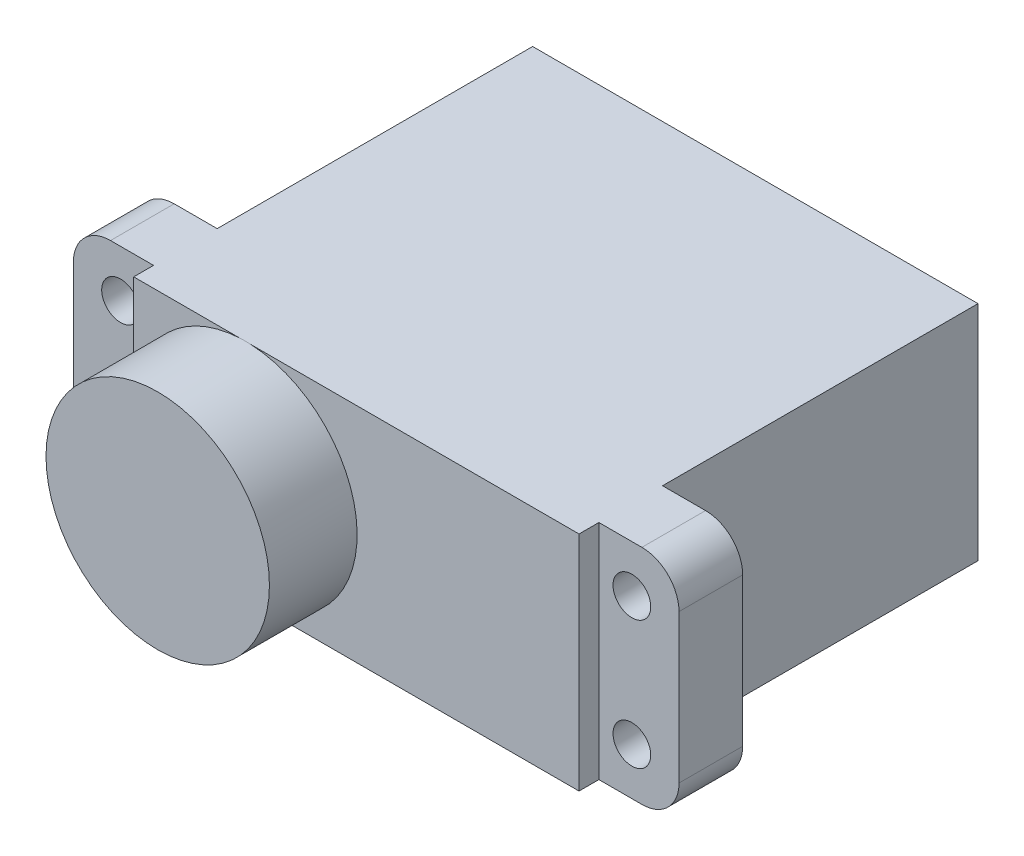
ISO-10303-21;
HEADER;
FILE_DESCRIPTION(('STEP AP214'),'2;1');
FILE_NAME('part.step','',(''),(''),'','','');
FILE_SCHEMA(('AUTOMOTIVE_DESIGN { 1 0 10303 214 1 1 1 1 }'));
ENDSEC;
DATA;
#1=APPLICATION_CONTEXT('core data for automotive mechanical design processes');
#2=APPLICATION_PROTOCOL_DEFINITION('international standard','automotive_design',2000,#1);
#3=PRODUCT_CONTEXT('',#1,'mechanical');
#4=PRODUCT('Part','Part','',(#3));
#5=PRODUCT_RELATED_PRODUCT_CATEGORY('part','',(#4));
#6=PRODUCT_DEFINITION_FORMATION('','',#4);
#7=PRODUCT_DEFINITION_CONTEXT('part definition',#1,'design');
#8=PRODUCT_DEFINITION('design','',#6,#7);
#9=PRODUCT_DEFINITION_SHAPE('','',#8);
#10=(LENGTH_UNIT() NAMED_UNIT(*) SI_UNIT(.MILLI.,.METRE.));
#11=(NAMED_UNIT(*) PLANE_ANGLE_UNIT() SI_UNIT($,.RADIAN.));
#12=(NAMED_UNIT(*) SI_UNIT($,.STERADIAN.) SOLID_ANGLE_UNIT());
#13=UNCERTAINTY_MEASURE_WITH_UNIT(LENGTH_MEASURE(1.E-05),#10,'distance_accuracy_value','');
#14=(GEOMETRIC_REPRESENTATION_CONTEXT(3) GLOBAL_UNCERTAINTY_ASSIGNED_CONTEXT((#13)) GLOBAL_UNIT_ASSIGNED_CONTEXT((#10,
#11,#12)) REPRESENTATION_CONTEXT('',''));
#15=CARTESIAN_POINT('',(0.,0.,0.));
#16=DIRECTION('',(0.,0.,1.));
#17=DIRECTION('',(1.,0.,0.));
#18=AXIS2_PLACEMENT_3D('',#15,#16,#17);
#19=CARTESIAN_POINT('',(0.,0.,21.5));
#20=DIRECTION('',(0.,0.,-1.));
#21=DIRECTION('',(-1.,0.,0.));
#22=AXIS2_PLACEMENT_3D('',#19,#20,#21);
#23=PLANE('',#22);
#24=CARTESIAN_POINT('',(-17.98,5.98713314139232,21.5));
#25=DIRECTION('',(0.,0.,1.));
#26=DIRECTION('',(1.,0.,0.));
#27=AXIS2_PLACEMENT_3D('',#24,#25,#26);
#28=CIRCLE('',#27,6.02);
#29=CARTESIAN_POINT('',(-18.2729712283782,12.,21.5));
#30=VERTEX_POINT('',#29);
#31=CARTESIAN_POINT('',(-24.,5.98713314139232,21.5));
#32=VERTEX_POINT('',#31);
#33=EDGE_CURVE('E11',#30,#32,#28,.T.);
#34=ORIENTED_EDGE('',*,*,#33,.F.);
#35=DIRECTION('',(-1.,0.,0.));
#36=VECTOR('',#35,1.);
#37=CARTESIAN_POINT('',(0.,12.,21.5));
#38=LINE('',#37,#36);
#39=CARTESIAN_POINT('',(-24.,12.,21.5));
#40=VERTEX_POINT('',#39);
#41=EDGE_CURVE('E168',#30,#40,#38,.T.);
#42=ORIENTED_EDGE('',*,*,#41,.T.);
#43=DIRECTION('',(0.,-1.,0.));
#44=VECTOR('',#43,1.);
#45=CARTESIAN_POINT('',(-24.,12.,21.5));
#46=LINE('',#45,#44);
#47=EDGE_CURVE('E337',#40,#32,#46,.T.);
#48=ORIENTED_EDGE('',*,*,#47,.T.);
#49=EDGE_LOOP('',(#34,#42,#48));
#50=FACE_BOUND('',#49,.T.);
#51=ADVANCED_FACE('F27',(#50),#23,.F.);
#52=CARTESIAN_POINT('',(-18.60820119965,0.,21.5));
#53=VERTEX_POINT('',#52);
#54=EDGE_CURVE('E36',#32,#53,#28,.T.);
#55=ORIENTED_EDGE('',*,*,#54,.F.);
#56=CARTESIAN_POINT('',(-24.,0.,21.5));
#57=VERTEX_POINT('',#56);
#58=EDGE_CURVE('E165',#32,#57,#46,.T.);
#59=ORIENTED_EDGE('',*,*,#58,.T.);
#60=DIRECTION('',(1.,0.,0.));
#61=VECTOR('',#60,1.);
#62=CARTESIAN_POINT('',(0.,0.,21.5));
#63=LINE('',#62,#61);
#64=EDGE_CURVE('E332',#57,#53,#63,.T.);
#65=ORIENTED_EDGE('',*,*,#64,.T.);
#66=EDGE_LOOP('',(#55,#59,#65));
#67=FACE_BOUND('',#66,.T.);
#68=ADVANCED_FACE('F262',(#67),#23,.F.);
#69=CARTESIAN_POINT('',(-17.35179880035,0.,21.5));
#70=VERTEX_POINT('',#69);
#71=CARTESIAN_POINT('',(-17.6870287716218,12.,21.5));
#72=VERTEX_POINT('',#71);
#73=EDGE_CURVE('E45',#70,#72,#28,.T.);
#74=ORIENTED_EDGE('',*,*,#73,.F.);
#75=CARTESIAN_POINT('',(0.,0.,21.5));
#76=VERTEX_POINT('',#75);
#77=EDGE_CURVE('E341',#70,#76,#63,.T.);
#78=ORIENTED_EDGE('',*,*,#77,.T.);
#79=DIRECTION('',(0.,1.,0.));
#80=VECTOR('',#79,1.);
#81=CARTESIAN_POINT('',(0.,12.,21.5));
#82=LINE('',#81,#80);
#83=CARTESIAN_POINT('',(0.,12.,21.5));
#84=VERTEX_POINT('',#83);
#85=EDGE_CURVE('E161',#76,#84,#82,.T.);
#86=ORIENTED_EDGE('',*,*,#85,.T.);
#87=EDGE_CURVE('E157',#84,#72,#38,.T.);
#88=ORIENTED_EDGE('',*,*,#87,.T.);
#89=EDGE_LOOP('',(#74,#78,#86,#88));
#90=FACE_BOUND('',#89,.T.);
#91=ADVANCED_FACE('F159',(#90),#23,.F.);
#92=CARTESIAN_POINT('',(4.318,12.,20.43));
#93=DIRECTION('',(0.,0.,1.));
#94=DIRECTION('',(1.,0.,0.));
#95=AXIS2_PLACEMENT_3D('',#92,#93,#94);
#96=PLANE('',#95);
#97=CARTESIAN_POINT('',(1.77799999999999,2.53620246957807,20.43));
#98=DIRECTION('',(0.,0.,-1.));
#99=DIRECTION('',(-1.,0.,0.));
#100=AXIS2_PLACEMENT_3D('',#97,#98,#99);
#101=CIRCLE('',#100,1.016);
#102=CARTESIAN_POINT('',(0.761999999999991,2.53620246957807,20.43));
#103=VERTEX_POINT('',#102);
#104=EDGE_CURVE('E192',#103,#103,#101,.T.);
#105=ORIENTED_EDGE('',*,*,#104,.T.);
#106=EDGE_LOOP('',(#105));
#107=FACE_BOUND('',#106,.T.);
#108=DIRECTION('',(-1.,0.,0.));
#109=VECTOR('',#108,1.);
#110=CARTESIAN_POINT('',(4.31799999999999,0.,20.43));
#111=LINE('',#110,#109);
#112=CARTESIAN_POINT('',(2.31799999999999,0.,20.43));
#113=VERTEX_POINT('',#112);
#114=CARTESIAN_POINT('',(0.,0.,20.43));
#115=VERTEX_POINT('',#114);
#116=EDGE_CURVE('E213',#113,#115,#111,.T.);
#117=ORIENTED_EDGE('',*,*,#116,.F.);
#118=CARTESIAN_POINT('',(2.31799999999999,2.,20.43));
#119=DIRECTION('',(0.,0.,1.));
#120=DIRECTION('',(1.,0.,0.));
#121=AXIS2_PLACEMENT_3D('',#118,#119,#120);
#122=CIRCLE('',#121,2.);
#123=CARTESIAN_POINT('',(4.31799999999999,2.,20.43));
#124=VERTEX_POINT('',#123);
#125=EDGE_CURVE('E223',#113,#124,#122,.T.);
#126=ORIENTED_EDGE('',*,*,#125,.T.);
#127=DIRECTION('',(0.,1.,0.));
#128=VECTOR('',#127,1.);
#129=CARTESIAN_POINT('',(4.318,12.,20.43));
#130=LINE('',#129,#128);
#131=CARTESIAN_POINT('',(4.318,10.,20.43));
#132=VERTEX_POINT('',#131);
#133=EDGE_CURVE('E416',#124,#132,#130,.T.);
#134=ORIENTED_EDGE('',*,*,#133,.T.);
#135=CARTESIAN_POINT('',(2.318,10.,20.43));
#136=DIRECTION('',(0.,0.,1.));
#137=DIRECTION('',(1.,0.,0.));
#138=AXIS2_PLACEMENT_3D('',#135,#136,#137);
#139=CIRCLE('',#138,2.);
#140=CARTESIAN_POINT('',(2.318,12.,20.43));
#141=VERTEX_POINT('',#140);
#142=EDGE_CURVE('E224',#132,#141,#139,.T.);
#143=ORIENTED_EDGE('',*,*,#142,.T.);
#144=DIRECTION('',(-1.,0.,0.));
#145=VECTOR('',#144,1.);
#146=CARTESIAN_POINT('',(4.318,12.,20.43));
#147=LINE('',#146,#145);
#148=CARTESIAN_POINT('',(0.,12.,20.43));
#149=VERTEX_POINT('',#148);
#150=EDGE_CURVE('E210',#141,#149,#147,.T.);
#151=ORIENTED_EDGE('',*,*,#150,.T.);
#152=DIRECTION('',(0.,1.,0.));
#153=VECTOR('',#152,1.);
#154=CARTESIAN_POINT('',(0.,12.,20.43));
#155=LINE('',#154,#153);
#156=EDGE_CURVE('E201',#115,#149,#155,.T.);
#157=ORIENTED_EDGE('',*,*,#156,.F.);
#158=EDGE_LOOP('',(#117,#126,#134,#143,#151,#157));
#159=FACE_BOUND('',#158,.T.);
#160=CARTESIAN_POINT('',(1.778,9.45999999999998,20.43));
#161=DIRECTION('',(0.,0.,-1.));
#162=DIRECTION('',(-1.,0.,0.));
#163=AXIS2_PLACEMENT_3D('',#160,#161,#162);
#164=CIRCLE('',#163,1.016);
#165=CARTESIAN_POINT('',(0.761999999999998,9.45999999999998,20.43));
#166=VERTEX_POINT('',#165);
#167=EDGE_CURVE('E187',#166,#166,#164,.T.);
#168=ORIENTED_EDGE('',*,*,#167,.T.);
#169=EDGE_LOOP('',(#168));
#170=FACE_BOUND('',#169,.T.);
#171=ADVANCED_FACE('F242',(#107,#159,#170),#96,.T.);
#172=CARTESIAN_POINT('',(4.318,12.,17.));
#173=DIRECTION('',(0.,0.,-1.));
#174=DIRECTION('',(-1.,0.,0.));
#175=AXIS2_PLACEMENT_3D('',#172,#173,#174);
#176=PLANE('',#175);
#177=CARTESIAN_POINT('',(1.77799999999999,2.53620246957807,17.));
#178=DIRECTION('',(0.,0.,-1.));
#179=DIRECTION('',(-1.,0.,0.));
#180=AXIS2_PLACEMENT_3D('',#177,#178,#179);
#181=CIRCLE('',#180,1.016);
#182=CARTESIAN_POINT('',(0.761999999999991,2.53620246957807,17.));
#183=VERTEX_POINT('',#182);
#184=EDGE_CURVE('E195',#183,#183,#181,.F.);
#185=ORIENTED_EDGE('',*,*,#184,.T.);
#186=EDGE_LOOP('',(#185));
#187=FACE_BOUND('',#186,.T.);
#188=DIRECTION('',(0.,-1.,0.));
#189=VECTOR('',#188,1.);
#190=CARTESIAN_POINT('',(4.318,12.,17.));
#191=LINE('',#190,#189);
#192=CARTESIAN_POINT('',(4.318,10.,17.));
#193=VERTEX_POINT('',#192);
#194=CARTESIAN_POINT('',(4.31799999999999,2.,17.));
#195=VERTEX_POINT('',#194);
#196=EDGE_CURVE('E417',#193,#195,#191,.T.);
#197=ORIENTED_EDGE('',*,*,#196,.T.);
#198=CARTESIAN_POINT('',(2.31799999999999,2.,17.));
#199=DIRECTION('',(0.,0.,-1.));
#200=DIRECTION('',(-1.,0.,0.));
#201=AXIS2_PLACEMENT_3D('',#198,#199,#200);
#202=CIRCLE('',#201,2.);
#203=CARTESIAN_POINT('',(2.31799999999999,0.,17.));
#204=VERTEX_POINT('',#203);
#205=EDGE_CURVE('E183',#195,#204,#202,.T.);
#206=ORIENTED_EDGE('',*,*,#205,.T.);
#207=DIRECTION('',(-1.,0.,0.));
#208=VECTOR('',#207,1.);
#209=CARTESIAN_POINT('',(4.31799999999999,0.,17.));
#210=LINE('',#209,#208);
#211=CARTESIAN_POINT('',(0.,0.,17.));
#212=VERTEX_POINT('',#211);
#213=EDGE_CURVE('E217',#204,#212,#210,.T.);
#214=ORIENTED_EDGE('',*,*,#213,.T.);
#215=DIRECTION('',(0.,-1.,0.));
#216=VECTOR('',#215,1.);
#217=CARTESIAN_POINT('',(0.,12.,17.));
#218=LINE('',#217,#216);
#219=CARTESIAN_POINT('',(0.,12.,17.));
#220=VERTEX_POINT('',#219);
#221=EDGE_CURVE('E205',#220,#212,#218,.T.);
#222=ORIENTED_EDGE('',*,*,#221,.F.);
#223=DIRECTION('',(-1.,0.,0.));
#224=VECTOR('',#223,1.);
#225=CARTESIAN_POINT('',(4.318,12.,17.));
#226=LINE('',#225,#224);
#227=CARTESIAN_POINT('',(2.318,12.,17.));
#228=VERTEX_POINT('',#227);
#229=EDGE_CURVE('E420',#228,#220,#226,.T.);
#230=ORIENTED_EDGE('',*,*,#229,.F.);
#231=CARTESIAN_POINT('',(2.318,10.,17.));
#232=DIRECTION('',(0.,0.,-1.));
#233=DIRECTION('',(-1.,0.,0.));
#234=AXIS2_PLACEMENT_3D('',#231,#232,#233);
#235=CIRCLE('',#234,2.);
#236=EDGE_CURVE('E425',#228,#193,#235,.T.);
#237=ORIENTED_EDGE('',*,*,#236,.T.);
#238=EDGE_LOOP('',(#197,#206,#214,#222,#230,#237));
#239=FACE_BOUND('',#238,.T.);
#240=CARTESIAN_POINT('',(1.778,9.45999999999998,17.));
#241=DIRECTION('',(0.,0.,-1.));
#242=DIRECTION('',(-1.,0.,0.));
#243=AXIS2_PLACEMENT_3D('',#240,#241,#242);
#244=CIRCLE('',#243,1.016);
#245=CARTESIAN_POINT('',(0.761999999999998,9.45999999999998,17.));
#246=VERTEX_POINT('',#245);
#247=EDGE_CURVE('E31',#246,#246,#244,.F.);
#248=ORIENTED_EDGE('',*,*,#247,.T.);
#249=EDGE_LOOP('',(#248));
#250=FACE_BOUND('',#249,.T.);
#251=ADVANCED_FACE('F231',(#187,#239,#250),#176,.T.);
#252=CARTESIAN_POINT('',(0.,12.,21.5));
#253=DIRECTION('',(-1.,0.,0.));
#254=DIRECTION('',(0.,0.,1.));
#255=AXIS2_PLACEMENT_3D('',#252,#253,#254);
#256=PLANE('',#255);
#257=DIRECTION('',(0.,0.,-1.));
#258=VECTOR('',#257,1.);
#259=CARTESIAN_POINT('',(0.,0.,21.5));
#260=LINE('',#259,#258);
#261=EDGE_CURVE('E354',#76,#115,#260,.T.);
#262=ORIENTED_EDGE('',*,*,#261,.T.);
#263=ORIENTED_EDGE('',*,*,#156,.T.);
#264=DIRECTION('',(0.,0.,-1.));
#265=VECTOR('',#264,1.);
#266=CARTESIAN_POINT('',(0.,12.,21.5));
#267=LINE('',#266,#265);
#268=EDGE_CURVE('E361',#84,#149,#267,.T.);
#269=ORIENTED_EDGE('',*,*,#268,.F.);
#270=ORIENTED_EDGE('',*,*,#85,.F.);
#271=EDGE_LOOP('',(#262,#263,#269,#270));
#272=FACE_BOUND('',#271,.T.);
#273=ADVANCED_FACE('F284',(#272),#256,.F.);
#274=CARTESIAN_POINT('',(-24.,12.,21.5));
#275=DIRECTION('',(1.,0.,0.));
#276=DIRECTION('',(0.,1.,0.));
#277=AXIS2_PLACEMENT_3D('',#274,#275,#276);
#278=PLANE('',#277);
#279=DIRECTION('',(0.,1.,0.));
#280=VECTOR('',#279,1.);
#281=CARTESIAN_POINT('',(-24.,12.,20.43));
#282=LINE('',#281,#280);
#283=CARTESIAN_POINT('',(-24.,0.,20.43));
#284=VERTEX_POINT('',#283);
#285=CARTESIAN_POINT('',(-24.,12.,20.43));
#286=VERTEX_POINT('',#285);
#287=EDGE_CURVE('E378',#284,#286,#282,.T.);
#288=ORIENTED_EDGE('',*,*,#287,.F.);
#289=DIRECTION('',(0.,0.,-1.));
#290=VECTOR('',#289,1.);
#291=CARTESIAN_POINT('',(-24.,0.,21.5));
#292=LINE('',#291,#290);
#293=EDGE_CURVE('E339',#57,#284,#292,.T.);
#294=ORIENTED_EDGE('',*,*,#293,.F.);
#295=ORIENTED_EDGE('',*,*,#58,.F.);
#296=ORIENTED_EDGE('',*,*,#47,.F.);
#297=DIRECTION('',(0.,0.,-1.));
#298=VECTOR('',#297,1.);
#299=CARTESIAN_POINT('',(-24.,12.,21.5));
#300=LINE('',#299,#298);
#301=EDGE_CURVE('E362',#40,#286,#300,.T.);
#302=ORIENTED_EDGE('',*,*,#301,.T.);
#303=EDGE_LOOP('',(#288,#294,#295,#296,#302));
#304=FACE_BOUND('',#303,.T.);
#305=ADVANCED_FACE('F279',(#304),#278,.F.);
#306=DIRECTION('',(0.,-1.,0.));
#307=VECTOR('',#306,1.);
#308=CARTESIAN_POINT('',(-24.,12.,17.));
#309=LINE('',#308,#307);
#310=CARTESIAN_POINT('',(-24.,12.,17.));
#311=VERTEX_POINT('',#310);
#312=CARTESIAN_POINT('',(-24.,0.,17.));
#313=VERTEX_POINT('',#312);
#314=EDGE_CURVE('E373',#311,#313,#309,.T.);
#315=ORIENTED_EDGE('',*,*,#314,.F.);
#316=CARTESIAN_POINT('',(-24.,12.,0.));
#317=VERTEX_POINT('',#316);
#318=EDGE_CURVE('E369',#311,#317,#300,.T.);
#319=ORIENTED_EDGE('',*,*,#318,.T.);
#320=DIRECTION('',(0.,-1.,0.));
#321=VECTOR('',#320,1.);
#322=CARTESIAN_POINT('',(-24.,12.,0.));
#323=LINE('',#322,#321);
#324=CARTESIAN_POINT('',(-24.,0.,0.));
#325=VERTEX_POINT('',#324);
#326=EDGE_CURVE('E398',#317,#325,#323,.T.);
#327=ORIENTED_EDGE('',*,*,#326,.T.);
#328=EDGE_CURVE('E357',#313,#325,#292,.T.);
#329=ORIENTED_EDGE('',*,*,#328,.F.);
#330=EDGE_LOOP('',(#315,#319,#327,#329));
#331=FACE_BOUND('',#330,.T.);
#332=ADVANCED_FACE('F283',(#331),#278,.F.);
#333=CARTESIAN_POINT('',(0.,12.,0.));
#334=VERTEX_POINT('',#333);
#335=EDGE_CURVE('E358',#220,#334,#267,.T.);
#336=ORIENTED_EDGE('',*,*,#335,.F.);
#337=ORIENTED_EDGE('',*,*,#221,.T.);
#338=CARTESIAN_POINT('',(0.,0.,0.));
#339=VERTEX_POINT('',#338);
#340=EDGE_CURVE('E345',#212,#339,#260,.T.);
#341=ORIENTED_EDGE('',*,*,#340,.T.);
#342=DIRECTION('',(0.,1.,0.));
#343=VECTOR('',#342,1.);
#344=CARTESIAN_POINT('',(0.,12.,0.));
#345=LINE('',#344,#343);
#346=EDGE_CURVE('E391',#339,#334,#345,.T.);
#347=ORIENTED_EDGE('',*,*,#346,.T.);
#348=EDGE_LOOP('',(#336,#337,#341,#347));
#349=FACE_BOUND('',#348,.T.);
#350=ADVANCED_FACE('F29',(#349),#256,.F.);
#351=CARTESIAN_POINT('',(0.,12.,21.5));
#352=DIRECTION('',(0.,-1.,0.));
#353=DIRECTION('',(1.,0.,0.));
#354=AXIS2_PLACEMENT_3D('',#351,#352,#353);
#355=PLANE('',#354);
#356=ORIENTED_EDGE('',*,*,#150,.F.);
#357=DIRECTION('',(0.,0.,-1.));
#358=VECTOR('',#357,1.);
#359=CARTESIAN_POINT('',(2.318,12.,21.5));
#360=LINE('',#359,#358);
#361=EDGE_CURVE('E422',#141,#228,#360,.T.);
#362=ORIENTED_EDGE('',*,*,#361,.T.);
#363=ORIENTED_EDGE('',*,*,#229,.T.);
#364=ORIENTED_EDGE('',*,*,#335,.T.);
#365=DIRECTION('',(-1.,0.,0.));
#366=VECTOR('',#365,1.);
#367=CARTESIAN_POINT('',(0.,12.,0.));
#368=LINE('',#367,#366);
#369=EDGE_CURVE('E394',#334,#317,#368,.T.);
#370=ORIENTED_EDGE('',*,*,#369,.T.);
#371=ORIENTED_EDGE('',*,*,#318,.F.);
#372=DIRECTION('',(1.,0.,0.));
#373=VECTOR('',#372,1.);
#374=CARTESIAN_POINT('',(-28.318,12.,17.));
#375=LINE('',#374,#373);
#376=CARTESIAN_POINT('',(-26.318,12.,17.));
#377=VERTEX_POINT('',#376);
#378=EDGE_CURVE('E464',#377,#311,#375,.T.);
#379=ORIENTED_EDGE('',*,*,#378,.F.);
#380=DIRECTION('',(0.,0.,-1.));
#381=VECTOR('',#380,1.);
#382=CARTESIAN_POINT('',(-26.318,12.,21.5));
#383=LINE('',#382,#381);
#384=CARTESIAN_POINT('',(-26.318,12.,20.43));
#385=VERTEX_POINT('',#384);
#386=EDGE_CURVE('E483',#377,#385,#383,.F.);
#387=ORIENTED_EDGE('',*,*,#386,.T.);
#388=DIRECTION('',(1.,0.,0.));
#389=VECTOR('',#388,1.);
#390=CARTESIAN_POINT('',(-28.318,12.,20.43));
#391=LINE('',#390,#389);
#392=EDGE_CURVE('E395',#385,#286,#391,.T.);
#393=ORIENTED_EDGE('',*,*,#392,.T.);
#394=ORIENTED_EDGE('',*,*,#301,.F.);
#395=ORIENTED_EDGE('',*,*,#41,.F.);
#396=EDGE_CURVE('E166',#72,#30,#38,.T.);
#397=ORIENTED_EDGE('',*,*,#396,.F.);
#398=ORIENTED_EDGE('',*,*,#87,.F.);
#399=ORIENTED_EDGE('',*,*,#268,.T.);
#400=EDGE_LOOP('',(#356,#362,#363,#364,#370,#371,#379,#387,#393,#394,#395,#397,#398,#399));
#401=FACE_BOUND('',#400,.T.);
#402=ADVANCED_FACE('F172',(#401),#355,.F.);
#403=CARTESIAN_POINT('',(0.,0.,21.5));
#404=DIRECTION('',(0.,1.,0.));
#405=DIRECTION('',(-1.,0.,0.));
#406=AXIS2_PLACEMENT_3D('',#403,#404,#405);
#407=PLANE('',#406);
#408=ORIENTED_EDGE('',*,*,#213,.F.);
#409=DIRECTION('',(0.,0.,1.));
#410=VECTOR('',#409,1.);
#411=CARTESIAN_POINT('',(2.31799999999999,0.,21.5));
#412=LINE('',#411,#410);
#413=EDGE_CURVE('E220',#204,#113,#412,.T.);
#414=ORIENTED_EDGE('',*,*,#413,.T.);
#415=ORIENTED_EDGE('',*,*,#116,.T.);
#416=ORIENTED_EDGE('',*,*,#261,.F.);
#417=ORIENTED_EDGE('',*,*,#77,.F.);
#418=EDGE_CURVE('E52',#53,#70,#63,.T.);
#419=ORIENTED_EDGE('',*,*,#418,.F.);
#420=ORIENTED_EDGE('',*,*,#64,.F.);
#421=ORIENTED_EDGE('',*,*,#293,.T.);
#422=DIRECTION('',(1.,0.,0.));
#423=VECTOR('',#422,1.);
#424=CARTESIAN_POINT('',(-28.318,0.,20.43));
#425=LINE('',#424,#423);
#426=CARTESIAN_POINT('',(-26.318,0.,20.43));
#427=VERTEX_POINT('',#426);
#428=EDGE_CURVE('E390',#427,#284,#425,.T.);
#429=ORIENTED_EDGE('',*,*,#428,.F.);
#430=DIRECTION('',(0.,0.,1.));
#431=VECTOR('',#430,1.);
#432=CARTESIAN_POINT('',(-26.318,0.,21.5));
#433=LINE('',#432,#431);
#434=CARTESIAN_POINT('',(-26.318,0.,17.));
#435=VERTEX_POINT('',#434);
#436=EDGE_CURVE('E459',#427,#435,#433,.F.);
#437=ORIENTED_EDGE('',*,*,#436,.T.);
#438=DIRECTION('',(1.,0.,0.));
#439=VECTOR('',#438,1.);
#440=CARTESIAN_POINT('',(-28.318,0.,17.));
#441=LINE('',#440,#439);
#442=EDGE_CURVE('E462',#435,#313,#441,.T.);
#443=ORIENTED_EDGE('',*,*,#442,.T.);
#444=ORIENTED_EDGE('',*,*,#328,.T.);
#445=DIRECTION('',(1.,0.,0.));
#446=VECTOR('',#445,1.);
#447=CARTESIAN_POINT('',(0.,0.,0.));
#448=LINE('',#447,#446);
#449=EDGE_CURVE('E401',#325,#339,#448,.T.);
#450=ORIENTED_EDGE('',*,*,#449,.T.);
#451=ORIENTED_EDGE('',*,*,#340,.F.);
#452=EDGE_LOOP('',(#408,#414,#415,#416,#417,#419,#420,#421,#429,#437,#443,#444,#450,#451));
#453=FACE_BOUND('',#452,.T.);
#454=ADVANCED_FACE('F294',(#453),#407,.F.);
#455=CARTESIAN_POINT('',(0.,0.,0.));
#456=DIRECTION('',(0.,0.,-1.));
#457=DIRECTION('',(-1.,0.,0.));
#458=AXIS2_PLACEMENT_3D('',#455,#456,#457);
#459=PLANE('',#458);
#460=ORIENTED_EDGE('',*,*,#346,.F.);
#461=ORIENTED_EDGE('',*,*,#449,.F.);
#462=ORIENTED_EDGE('',*,*,#326,.F.);
#463=ORIENTED_EDGE('',*,*,#369,.F.);
#464=EDGE_LOOP('',(#460,#461,#462,#463));
#465=FACE_BOUND('',#464,.T.);
#466=ADVANCED_FACE('F300',(#465),#459,.T.);
#467=CARTESIAN_POINT('',(-28.318,12.,20.43));
#468=DIRECTION('',(0.,0.,-1.));
#469=DIRECTION('',(-1.,0.,0.));
#470=AXIS2_PLACEMENT_3D('',#467,#468,#469);
#471=PLANE('',#470);
#472=CARTESIAN_POINT('',(-25.778,9.46,20.43));
#473=DIRECTION('',(0.,0.,1.));
#474=DIRECTION('',(1.,0.,0.));
#475=AXIS2_PLACEMENT_3D('',#472,#473,#474);
#476=CIRCLE('',#475,1.016);
#477=CARTESIAN_POINT('',(-24.762,9.46,20.43));
#478=VERTEX_POINT('',#477);
#479=EDGE_CURVE('E216',#478,#478,#476,.T.);
#480=ORIENTED_EDGE('',*,*,#479,.F.);
#481=EDGE_LOOP('',(#480));
#482=FACE_BOUND('',#481,.T.);
#483=CARTESIAN_POINT('',(-25.778,2.53620246957809,20.43));
#484=DIRECTION('',(0.,0.,1.));
#485=DIRECTION('',(1.,0.,0.));
#486=AXIS2_PLACEMENT_3D('',#483,#484,#485);
#487=CIRCLE('',#486,1.016);
#488=CARTESIAN_POINT('',(-24.762,2.53620246957809,20.43));
#489=VERTEX_POINT('',#488);
#490=EDGE_CURVE('E447',#489,#489,#487,.T.);
#491=ORIENTED_EDGE('',*,*,#490,.F.);
#492=EDGE_LOOP('',(#491));
#493=FACE_BOUND('',#492,.T.);
#494=DIRECTION('',(0.,1.,0.));
#495=VECTOR('',#494,1.);
#496=CARTESIAN_POINT('',(-28.318,12.,20.43));
#497=LINE('',#496,#495);
#498=CARTESIAN_POINT('',(-28.318,2.,20.43));
#499=VERTEX_POINT('',#498);
#500=CARTESIAN_POINT('',(-28.318,10.,20.43));
#501=VERTEX_POINT('',#500);
#502=EDGE_CURVE('E377',#499,#501,#497,.T.);
#503=ORIENTED_EDGE('',*,*,#502,.F.);
#504=CARTESIAN_POINT('',(-26.318,2.,20.43));
#505=DIRECTION('',(0.,0.,-1.));
#506=DIRECTION('',(-1.,0.,0.));
#507=AXIS2_PLACEMENT_3D('',#504,#505,#506);
#508=CIRCLE('',#507,2.);
#509=EDGE_CURVE('E461',#499,#427,#508,.F.);
#510=ORIENTED_EDGE('',*,*,#509,.T.);
#511=ORIENTED_EDGE('',*,*,#428,.T.);
#512=ORIENTED_EDGE('',*,*,#287,.T.);
#513=ORIENTED_EDGE('',*,*,#392,.F.);
#514=CARTESIAN_POINT('',(-26.318,10.,20.43));
#515=DIRECTION('',(0.,0.,-1.));
#516=DIRECTION('',(-1.,0.,0.));
#517=AXIS2_PLACEMENT_3D('',#514,#515,#516);
#518=CIRCLE('',#517,2.);
#519=EDGE_CURVE('E484',#385,#501,#518,.F.);
#520=ORIENTED_EDGE('',*,*,#519,.T.);
#521=EDGE_LOOP('',(#503,#510,#511,#512,#513,#520));
#522=FACE_BOUND('',#521,.T.);
#523=ADVANCED_FACE('F498',(#482,#493,#522),#471,.F.);
#524=CARTESIAN_POINT('',(-28.318,12.,17.));
#525=DIRECTION('',(0.,0.,1.));
#526=DIRECTION('',(1.,0.,0.));
#527=AXIS2_PLACEMENT_3D('',#524,#525,#526);
#528=PLANE('',#527);
#529=CARTESIAN_POINT('',(-25.778,9.46,17.));
#530=DIRECTION('',(0.,0.,1.));
#531=DIRECTION('',(1.,0.,0.));
#532=AXIS2_PLACEMENT_3D('',#529,#530,#531);
#533=CIRCLE('',#532,1.016);
#534=CARTESIAN_POINT('',(-24.762,9.46,17.));
#535=VERTEX_POINT('',#534);
#536=EDGE_CURVE('E446',#535,#535,#533,.T.);
#537=ORIENTED_EDGE('',*,*,#536,.T.);
#538=EDGE_LOOP('',(#537));
#539=FACE_BOUND('',#538,.T.);
#540=CARTESIAN_POINT('',(-25.778,2.53620246957809,17.));
#541=DIRECTION('',(0.,0.,1.));
#542=DIRECTION('',(1.,0.,0.));
#543=AXIS2_PLACEMENT_3D('',#540,#541,#542);
#544=CIRCLE('',#543,1.016);
#545=CARTESIAN_POINT('',(-24.762,2.53620246957809,17.));
#546=VERTEX_POINT('',#545);
#547=EDGE_CURVE('E449',#546,#546,#544,.T.);
#548=ORIENTED_EDGE('',*,*,#547,.T.);
#549=EDGE_LOOP('',(#548));
#550=FACE_BOUND('',#549,.T.);
#551=ORIENTED_EDGE('',*,*,#442,.F.);
#552=CARTESIAN_POINT('',(-26.318,2.,17.));
#553=DIRECTION('',(0.,0.,1.));
#554=DIRECTION('',(1.,0.,0.));
#555=AXIS2_PLACEMENT_3D('',#552,#553,#554);
#556=CIRCLE('',#555,2.);
#557=CARTESIAN_POINT('',(-28.318,2.,17.));
#558=VERTEX_POINT('',#557);
#559=EDGE_CURVE('E426',#435,#558,#556,.F.);
#560=ORIENTED_EDGE('',*,*,#559,.T.);
#561=DIRECTION('',(0.,-1.,0.));
#562=VECTOR('',#561,1.);
#563=CARTESIAN_POINT('',(-28.318,12.,17.));
#564=LINE('',#563,#562);
#565=CARTESIAN_POINT('',(-28.318,10.,17.));
#566=VERTEX_POINT('',#565);
#567=EDGE_CURVE('E387',#566,#558,#564,.T.);
#568=ORIENTED_EDGE('',*,*,#567,.F.);
#569=CARTESIAN_POINT('',(-26.318,10.,17.));
#570=DIRECTION('',(0.,0.,1.));
#571=DIRECTION('',(1.,0.,0.));
#572=AXIS2_PLACEMENT_3D('',#569,#570,#571);
#573=CIRCLE('',#572,2.);
#574=EDGE_CURVE('E477',#566,#377,#573,.F.);
#575=ORIENTED_EDGE('',*,*,#574,.T.);
#576=ORIENTED_EDGE('',*,*,#378,.T.);
#577=ORIENTED_EDGE('',*,*,#314,.T.);
#578=EDGE_LOOP('',(#551,#560,#568,#575,#576,#577));
#579=FACE_BOUND('',#578,.T.);
#580=ADVANCED_FACE('F505',(#539,#550,#579),#528,.F.);
#581=CARTESIAN_POINT('',(-28.318,12.,20.43));
#582=DIRECTION('',(1.,0.,0.));
#583=DIRECTION('',(0.,1.,0.));
#584=AXIS2_PLACEMENT_3D('',#581,#582,#583);
#585=PLANE('',#584);
#586=ORIENTED_EDGE('',*,*,#567,.T.);
#587=DIRECTION('',(0.,0.,1.));
#588=VECTOR('',#587,1.);
#589=CARTESIAN_POINT('',(-28.318,2.,20.43));
#590=LINE('',#589,#588);
#591=EDGE_CURVE('E466',#558,#499,#590,.T.);
#592=ORIENTED_EDGE('',*,*,#591,.T.);
#593=ORIENTED_EDGE('',*,*,#502,.T.);
#594=DIRECTION('',(0.,0.,-1.));
#595=VECTOR('',#594,1.);
#596=CARTESIAN_POINT('',(-28.318,10.,20.43));
#597=LINE('',#596,#595);
#598=EDGE_CURVE('E474',#501,#566,#597,.T.);
#599=ORIENTED_EDGE('',*,*,#598,.T.);
#600=EDGE_LOOP('',(#586,#592,#593,#599));
#601=FACE_BOUND('',#600,.T.);
#602=ADVANCED_FACE('F494',(#601),#585,.F.);
#603=CARTESIAN_POINT('',(-26.318,10.,20.43));
#604=DIRECTION('',(0.,0.,-1.));
#605=DIRECTION('',(-1.,0.,0.));
#606=AXIS2_PLACEMENT_3D('',#603,#604,#605);
#607=CYLINDRICAL_SURFACE('',#606,2.);
#608=ORIENTED_EDGE('',*,*,#519,.F.);
#609=ORIENTED_EDGE('',*,*,#386,.F.);
#610=ORIENTED_EDGE('',*,*,#574,.F.);
#611=ORIENTED_EDGE('',*,*,#598,.F.);
#612=EDGE_LOOP('',(#608,#609,#610,#611));
#613=FACE_BOUND('',#612,.T.);
#614=ADVANCED_FACE('F512',(#613),#607,.T.);
#615=CARTESIAN_POINT('',(-26.318,2.,20.43));
#616=DIRECTION('',(0.,0.,1.));
#617=DIRECTION('',(1.,0.,0.));
#618=AXIS2_PLACEMENT_3D('',#615,#616,#617);
#619=CYLINDRICAL_SURFACE('',#618,2.);
#620=ORIENTED_EDGE('',*,*,#559,.F.);
#621=ORIENTED_EDGE('',*,*,#436,.F.);
#622=ORIENTED_EDGE('',*,*,#509,.F.);
#623=ORIENTED_EDGE('',*,*,#591,.F.);
#624=EDGE_LOOP('',(#620,#621,#622,#623));
#625=FACE_BOUND('',#624,.T.);
#626=ADVANCED_FACE('F503',(#625),#619,.T.);
#627=CARTESIAN_POINT('',(-25.778,2.53620246957809,16.112));
#628=DIRECTION('',(0.,0.,1.));
#629=DIRECTION('',(1.,0.,0.));
#630=AXIS2_PLACEMENT_3D('',#627,#628,#629);
#631=CYLINDRICAL_SURFACE('',#630,1.016);
#632=ORIENTED_EDGE('',*,*,#490,.T.);
#633=EDGE_LOOP('',(#632));
#634=FACE_BOUND('',#633,.T.);
#635=ORIENTED_EDGE('',*,*,#547,.F.);
#636=EDGE_LOOP('',(#635));
#637=FACE_BOUND('',#636,.T.);
#638=ADVANCED_FACE('F520',(#634,#637),#631,.F.);
#639=CARTESIAN_POINT('',(-25.778,9.46,16.112));
#640=DIRECTION('',(0.,0.,1.));
#641=DIRECTION('',(1.,0.,0.));
#642=AXIS2_PLACEMENT_3D('',#639,#640,#641);
#643=CYLINDRICAL_SURFACE('',#642,1.016);
#644=ORIENTED_EDGE('',*,*,#479,.T.);
#645=EDGE_LOOP('',(#644));
#646=FACE_BOUND('',#645,.T.);
#647=ORIENTED_EDGE('',*,*,#536,.F.);
#648=EDGE_LOOP('',(#647));
#649=FACE_BOUND('',#648,.T.);
#650=ADVANCED_FACE('F557',(#646,#649),#643,.F.);
#651=CARTESIAN_POINT('',(4.318,12.,20.43));
#652=DIRECTION('',(-1.,0.,0.));
#653=DIRECTION('',(0.,1.,0.));
#654=AXIS2_PLACEMENT_3D('',#651,#652,#653);
#655=PLANE('',#654);
#656=ORIENTED_EDGE('',*,*,#133,.F.);
#657=DIRECTION('',(0.,0.,1.));
#658=VECTOR('',#657,1.);
#659=CARTESIAN_POINT('',(4.31799999999999,2.,20.43));
#660=LINE('',#659,#658);
#661=EDGE_CURVE('E226',#124,#195,#660,.F.);
#662=ORIENTED_EDGE('',*,*,#661,.T.);
#663=ORIENTED_EDGE('',*,*,#196,.F.);
#664=DIRECTION('',(0.,0.,-1.));
#665=VECTOR('',#664,1.);
#666=CARTESIAN_POINT('',(4.318,10.,20.43));
#667=LINE('',#666,#665);
#668=EDGE_CURVE('E428',#193,#132,#667,.F.);
#669=ORIENTED_EDGE('',*,*,#668,.T.);
#670=EDGE_LOOP('',(#656,#662,#663,#669));
#671=FACE_BOUND('',#670,.T.);
#672=ADVANCED_FACE('F441',(#671),#655,.F.);
#673=CARTESIAN_POINT('',(2.318,10.,21.5));
#674=DIRECTION('',(0.,0.,-1.));
#675=DIRECTION('',(-1.,0.,0.));
#676=AXIS2_PLACEMENT_3D('',#673,#674,#675);
#677=CYLINDRICAL_SURFACE('',#676,2.);
#678=ORIENTED_EDGE('',*,*,#142,.F.);
#679=ORIENTED_EDGE('',*,*,#668,.F.);
#680=ORIENTED_EDGE('',*,*,#236,.F.);
#681=ORIENTED_EDGE('',*,*,#361,.F.);
#682=EDGE_LOOP('',(#678,#679,#680,#681));
#683=FACE_BOUND('',#682,.T.);
#684=ADVANCED_FACE('F435',(#683),#677,.T.);
#685=CARTESIAN_POINT('',(2.31799999999999,2.,21.5));
#686=DIRECTION('',(0.,0.,1.));
#687=DIRECTION('',(1.,0.,0.));
#688=AXIS2_PLACEMENT_3D('',#685,#686,#687);
#689=CYLINDRICAL_SURFACE('',#688,2.);
#690=ORIENTED_EDGE('',*,*,#205,.F.);
#691=ORIENTED_EDGE('',*,*,#661,.F.);
#692=ORIENTED_EDGE('',*,*,#125,.F.);
#693=ORIENTED_EDGE('',*,*,#413,.F.);
#694=EDGE_LOOP('',(#690,#691,#692,#693));
#695=FACE_BOUND('',#694,.T.);
#696=ADVANCED_FACE('F238',(#695),#689,.T.);
#697=CARTESIAN_POINT('',(1.77799999999999,2.53620246957807,16.112));
#698=DIRECTION('',(0.,0.,1.));
#699=DIRECTION('',(1.,0.,0.));
#700=AXIS2_PLACEMENT_3D('',#697,#698,#699);
#701=CYLINDRICAL_SURFACE('',#700,1.016);
#702=ORIENTED_EDGE('',*,*,#184,.F.);
#703=EDGE_LOOP('',(#702));
#704=FACE_BOUND('',#703,.T.);
#705=ORIENTED_EDGE('',*,*,#104,.F.);
#706=EDGE_LOOP('',(#705));
#707=FACE_BOUND('',#706,.T.);
#708=ADVANCED_FACE('F234',(#704,#707),#701,.F.);
#709=CARTESIAN_POINT('',(1.778,9.45999999999998,16.112));
#710=DIRECTION('',(0.,0.,1.));
#711=DIRECTION('',(1.,0.,0.));
#712=AXIS2_PLACEMENT_3D('',#709,#710,#711);
#713=CYLINDRICAL_SURFACE('',#712,1.016);
#714=ORIENTED_EDGE('',*,*,#247,.F.);
#715=EDGE_LOOP('',(#714));
#716=FACE_BOUND('',#715,.T.);
#717=ORIENTED_EDGE('',*,*,#167,.F.);
#718=EDGE_LOOP('',(#717));
#719=FACE_BOUND('',#718,.T.);
#720=ADVANCED_FACE('F237',(#716,#719),#713,.F.);
#721=CARTESIAN_POINT('',(-17.98,5.98713314139232,21.5));
#722=DIRECTION('',(0.,0.,1.));
#723=DIRECTION('',(1.,0.,0.));
#724=AXIS2_PLACEMENT_3D('',#721,#722,#723);
#725=PLANE('',#724);
#726=EDGE_CURVE('E180',#72,#30,#28,.T.);
#727=ORIENTED_EDGE('',*,*,#726,.F.);
#728=ORIENTED_EDGE('',*,*,#396,.T.);
#729=EDGE_LOOP('',(#727,#728));
#730=FACE_BOUND('',#729,.T.);
#731=ADVANCED_FACE('F184',(#730),#725,.F.);
#732=EDGE_CURVE('E38',#53,#70,#28,.T.);
#733=ORIENTED_EDGE('',*,*,#732,.F.);
#734=ORIENTED_EDGE('',*,*,#418,.T.);
#735=EDGE_LOOP('',(#733,#734));
#736=FACE_BOUND('',#735,.T.);
#737=ADVANCED_FACE('F258',(#736),#725,.F.);
#738=CARTESIAN_POINT('',(-17.98,5.98713314139232,26.225));
#739=DIRECTION('',(0.,0.,-1.));
#740=DIRECTION('',(-1.,0.,0.));
#741=AXIS2_PLACEMENT_3D('',#738,#739,#740);
#742=CYLINDRICAL_SURFACE('',#741,6.02);
#743=CARTESIAN_POINT('',(-17.98,5.98713314139232,26.225));
#744=DIRECTION('',(0.,0.,1.));
#745=DIRECTION('',(1.,0.,0.));
#746=AXIS2_PLACEMENT_3D('',#743,#744,#745);
#747=CIRCLE('',#746,6.02);
#748=CARTESIAN_POINT('',(-11.96,5.98713314139232,26.225));
#749=VERTEX_POINT('',#748);
#750=EDGE_CURVE('E185',#749,#749,#747,.T.);
#751=ORIENTED_EDGE('',*,*,#750,.F.);
#752=EDGE_LOOP('',(#751));
#753=FACE_BOUND('',#752,.T.);
#754=ORIENTED_EDGE('',*,*,#726,.T.);
#755=ORIENTED_EDGE('',*,*,#33,.T.);
#756=ORIENTED_EDGE('',*,*,#54,.T.);
#757=ORIENTED_EDGE('',*,*,#732,.T.);
#758=ORIENTED_EDGE('',*,*,#73,.T.);
#759=EDGE_LOOP('',(#754,#755,#756,#757,#758));
#760=FACE_BOUND('',#759,.T.);
#761=ADVANCED_FACE('F179',(#753,#760),#742,.T.);
#762=CARTESIAN_POINT('',(-17.98,5.98713314139232,26.225));
#763=DIRECTION('',(0.,0.,1.));
#764=DIRECTION('',(1.,0.,0.));
#765=AXIS2_PLACEMENT_3D('',#762,#763,#764);
#766=PLANE('',#765);
#767=ORIENTED_EDGE('',*,*,#750,.T.);
#768=EDGE_LOOP('',(#767));
#769=FACE_BOUND('',#768,.T.);
#770=ADVANCED_FACE('F319',(#769),#766,.T.);
#771=CLOSED_SHELL('',(#51,#68,#91,#171,#251,#273,#305,#332,#350,#402,#454,#466,#523,#580,#602,
#614,#626,#638,#650,#672,#684,#696,#708,#720,#731,#737,#761,#770));
#772=MANIFOLD_SOLID_BREP('B2',#771);
#773=ADVANCED_BREP_SHAPE_REPRESENTATION('',(#18,#772),#14);
#774=SHAPE_DEFINITION_REPRESENTATION(#9,#773);
ENDSEC;
END-ISO-10303-21;
